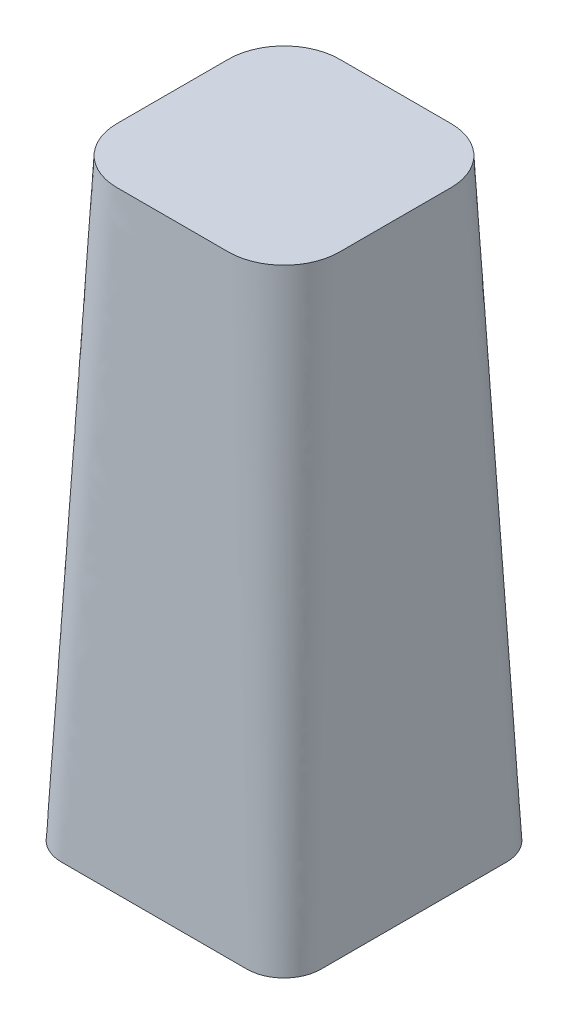
ISO-10303-21;
HEADER;
FILE_DESCRIPTION(('STEP AP214'),'2;1');
FILE_NAME('part.step','',(''),(''),'','','');
FILE_SCHEMA(('AUTOMOTIVE_DESIGN { 1 0 10303 214 1 1 1 1 }'));
ENDSEC;
DATA;
#1=APPLICATION_CONTEXT('core data for automotive mechanical design processes');
#2=APPLICATION_PROTOCOL_DEFINITION('international standard','automotive_design',2000,#1);
#3=PRODUCT_CONTEXT('',#1,'mechanical');
#4=PRODUCT('Part','Part','',(#3));
#5=PRODUCT_RELATED_PRODUCT_CATEGORY('part','',(#4));
#6=PRODUCT_DEFINITION_FORMATION('','',#4);
#7=PRODUCT_DEFINITION_CONTEXT('part definition',#1,'design');
#8=PRODUCT_DEFINITION('design','',#6,#7);
#9=PRODUCT_DEFINITION_SHAPE('','',#8);
#10=(LENGTH_UNIT() NAMED_UNIT(*) SI_UNIT(.MILLI.,.METRE.));
#11=(NAMED_UNIT(*) PLANE_ANGLE_UNIT() SI_UNIT($,.RADIAN.));
#12=(NAMED_UNIT(*) SI_UNIT($,.STERADIAN.) SOLID_ANGLE_UNIT());
#13=UNCERTAINTY_MEASURE_WITH_UNIT(LENGTH_MEASURE(1.E-05),#10,'distance_accuracy_value','');
#14=(GEOMETRIC_REPRESENTATION_CONTEXT(3) GLOBAL_UNCERTAINTY_ASSIGNED_CONTEXT((#13)) GLOBAL_UNIT_ASSIGNED_CONTEXT((#10,
#11,#12)) REPRESENTATION_CONTEXT('',''));
#15=CARTESIAN_POINT('',(0.,0.,0.));
#16=DIRECTION('',(0.,0.,1.));
#17=DIRECTION('',(1.,0.,0.));
#18=AXIS2_PLACEMENT_3D('',#15,#16,#17);
#19=CARTESIAN_POINT('',(-3.,32.,-3.));
#20=DIRECTION('',(0.,1.,0.));
#21=DIRECTION('',(0.,0.,1.));
#22=AXIS2_PLACEMENT_3D('',#19,#20,#21);
#23=PLANE('',#22);
#24=CARTESIAN_POINT('',(-3.,32.,-3.));
#25=DIRECTION('',(0.,1.,0.));
#26=DIRECTION('',(0.,0.,1.));
#27=AXIS2_PLACEMENT_3D('',#24,#25,#26);
#28=CIRCLE('',#27,3.);
#29=CARTESIAN_POINT('',(-2.99999999999998,32.,-6.));
#30=VERTEX_POINT('',#29);
#31=CARTESIAN_POINT('',(-6.,32.,-2.99999999995858));
#32=VERTEX_POINT('',#31);
#33=EDGE_CURVE('E422',#30,#32,#28,.T.);
#34=ORIENTED_EDGE('',*,*,#33,.T.);
#35=DIRECTION('',(0.,0.,1.));
#36=VECTOR('',#35,1.);
#37=CARTESIAN_POINT('',(-6.,32.,-2.99999999999998));
#38=LINE('',#37,#36);
#39=CARTESIAN_POINT('',(-6.,32.,2.99999999992025));
#40=VERTEX_POINT('',#39);
#41=EDGE_CURVE('E537',#32,#40,#38,.T.);
#42=ORIENTED_EDGE('',*,*,#41,.T.);
#43=CARTESIAN_POINT('',(-3.,32.,3.));
#44=DIRECTION('',(0.,1.,0.));
#45=DIRECTION('',(0.,0.,1.));
#46=AXIS2_PLACEMENT_3D('',#43,#44,#45);
#47=CIRCLE('',#46,3.);
#48=CARTESIAN_POINT('',(-2.9999999999586,32.,6.));
#49=VERTEX_POINT('',#48);
#50=EDGE_CURVE('E529',#40,#49,#47,.T.);
#51=ORIENTED_EDGE('',*,*,#50,.T.);
#52=DIRECTION('',(1.,0.,0.));
#53=VECTOR('',#52,1.);
#54=CARTESIAN_POINT('',(-2.99999999999998,32.,6.));
#55=LINE('',#54,#53);
#56=CARTESIAN_POINT('',(3.00000000000016,32.,6.));
#57=VERTEX_POINT('',#56);
#58=EDGE_CURVE('E523',#49,#57,#55,.T.);
#59=ORIENTED_EDGE('',*,*,#58,.T.);
#60=CARTESIAN_POINT('',(3.,32.,3.));
#61=DIRECTION('',(0.,1.,0.));
#62=DIRECTION('',(0.,0.,1.));
#63=AXIS2_PLACEMENT_3D('',#60,#61,#62);
#64=CIRCLE('',#63,3.);
#65=CARTESIAN_POINT('',(6.,32.,2.99999999995858));
#66=VERTEX_POINT('',#65);
#67=EDGE_CURVE('E515',#57,#66,#64,.T.);
#68=ORIENTED_EDGE('',*,*,#67,.T.);
#69=DIRECTION('',(0.,0.,1.));
#70=VECTOR('',#69,1.);
#71=CARTESIAN_POINT('',(6.,32.,-2.99999999999998));
#72=LINE('',#71,#70);
#73=CARTESIAN_POINT('',(6.,32.,-3.00000000000017));
#74=VERTEX_POINT('',#73);
#75=EDGE_CURVE('E507',#74,#66,#72,.T.);
#76=ORIENTED_EDGE('',*,*,#75,.F.);
#77=CARTESIAN_POINT('',(3.,32.,-3.));
#78=DIRECTION('',(0.,1.,0.));
#79=DIRECTION('',(0.,0.,1.));
#80=AXIS2_PLACEMENT_3D('',#77,#78,#79);
#81=CIRCLE('',#80,3.);
#82=CARTESIAN_POINT('',(2.99999999999998,32.,-6.));
#83=VERTEX_POINT('',#82);
#84=EDGE_CURVE('E243',#74,#83,#81,.T.);
#85=ORIENTED_EDGE('',*,*,#84,.T.);
#86=DIRECTION('',(1.,0.,0.));
#87=VECTOR('',#86,1.);
#88=CARTESIAN_POINT('',(-2.99999999999998,32.,-6.));
#89=LINE('',#88,#87);
#90=EDGE_CURVE('E12',#30,#83,#89,.T.);
#91=ORIENTED_EDGE('',*,*,#90,.F.);
#92=EDGE_LOOP('',(#34,#42,#51,#59,#68,#76,#85,#91));
#93=FACE_BOUND('',#92,.T.);
#94=ADVANCED_FACE('F231',(#93),#23,.T.);
#95=CARTESIAN_POINT('',(-5.,0.,-5.));
#96=DIRECTION('',(0.,1.,0.));
#97=DIRECTION('',(0.,0.,1.));
#98=AXIS2_PLACEMENT_3D('',#95,#96,#97);
#99=PLANE('',#98);
#100=CARTESIAN_POINT('',(-5.,0.,-5.));
#101=DIRECTION('',(0.,1.,0.));
#102=DIRECTION('',(0.,0.,1.));
#103=AXIS2_PLACEMENT_3D('',#100,#101,#102);
#104=CIRCLE('',#103,2.);
#105=CARTESIAN_POINT('',(-4.99999999999999,0.,-7.));
#106=VERTEX_POINT('',#105);
#107=CARTESIAN_POINT('',(-7.,0.,-4.99999999999999));
#108=VERTEX_POINT('',#107);
#109=EDGE_CURVE('E303',#106,#108,#104,.T.);
#110=ORIENTED_EDGE('',*,*,#109,.F.);
#111=DIRECTION('',(1.,0.,0.));
#112=VECTOR('',#111,1.);
#113=CARTESIAN_POINT('',(-4.99999999999999,0.,-7.));
#114=LINE('',#113,#112);
#115=CARTESIAN_POINT('',(4.99999999999999,0.,-7.));
#116=VERTEX_POINT('',#115);
#117=EDGE_CURVE('E312',#106,#116,#114,.T.);
#118=ORIENTED_EDGE('',*,*,#117,.T.);
#119=CARTESIAN_POINT('',(5.,0.,-5.));
#120=DIRECTION('',(0.,1.,0.));
#121=DIRECTION('',(0.,0.,1.));
#122=AXIS2_PLACEMENT_3D('',#119,#120,#121);
#123=CIRCLE('',#122,2.);
#124=CARTESIAN_POINT('',(7.,0.,-4.99999999999999));
#125=VERTEX_POINT('',#124);
#126=EDGE_CURVE('E427',#125,#116,#123,.T.);
#127=ORIENTED_EDGE('',*,*,#126,.F.);
#128=DIRECTION('',(0.,0.,1.));
#129=VECTOR('',#128,1.);
#130=CARTESIAN_POINT('',(7.,0.,-4.99999999999999));
#131=LINE('',#130,#129);
#132=CARTESIAN_POINT('',(7.,0.,4.99999999999999));
#133=VERTEX_POINT('',#132);
#134=EDGE_CURVE('E441',#125,#133,#131,.T.);
#135=ORIENTED_EDGE('',*,*,#134,.T.);
#136=CARTESIAN_POINT('',(5.,0.,5.));
#137=DIRECTION('',(0.,1.,0.));
#138=DIRECTION('',(0.,0.,1.));
#139=AXIS2_PLACEMENT_3D('',#136,#137,#138);
#140=CIRCLE('',#139,2.);
#141=CARTESIAN_POINT('',(4.99999999999999,0.,7.));
#142=VERTEX_POINT('',#141);
#143=EDGE_CURVE('E446',#142,#133,#140,.T.);
#144=ORIENTED_EDGE('',*,*,#143,.F.);
#145=DIRECTION('',(1.,0.,0.));
#146=VECTOR('',#145,1.);
#147=CARTESIAN_POINT('',(-4.99999999999999,0.,7.));
#148=LINE('',#147,#146);
#149=CARTESIAN_POINT('',(-5.,0.,7.));
#150=VERTEX_POINT('',#149);
#151=EDGE_CURVE('E461',#150,#142,#148,.T.);
#152=ORIENTED_EDGE('',*,*,#151,.F.);
#153=CARTESIAN_POINT('',(-5.,0.,5.));
#154=DIRECTION('',(0.,1.,0.));
#155=DIRECTION('',(0.,0.,1.));
#156=AXIS2_PLACEMENT_3D('',#153,#154,#155);
#157=CIRCLE('',#156,2.);
#158=CARTESIAN_POINT('',(-7.,0.,4.99999999999999));
#159=VERTEX_POINT('',#158);
#160=EDGE_CURVE('E305',#159,#150,#157,.T.);
#161=ORIENTED_EDGE('',*,*,#160,.F.);
#162=DIRECTION('',(0.,0.,1.));
#163=VECTOR('',#162,1.);
#164=CARTESIAN_POINT('',(-7.,0.,-4.99999999999999));
#165=LINE('',#164,#163);
#166=EDGE_CURVE('E300',#108,#159,#165,.T.);
#167=ORIENTED_EDGE('',*,*,#166,.F.);
#168=EDGE_LOOP('',(#110,#118,#127,#135,#144,#152,#161,#167));
#169=FACE_BOUND('',#168,.T.);
#170=ADVANCED_FACE('F297',(#169),#99,.F.);
#171=CARTESIAN_POINT('',(-7.,0.,4.99999999903776));
#172=CARTESIAN_POINT('',(-6.,32.,2.99999999921562));
#173=CARTESIAN_POINT('',(-7.,0.,5.18588729850112));
#174=CARTESIAN_POINT('',(-6.,32.,3.15152631043641));
#175=CARTESIAN_POINT('',(-6.95379278186887,0.,5.48488476142477));
#176=CARTESIAN_POINT('',(-5.97729903744131,32.,3.47485511021147));
#177=CARTESIAN_POINT('',(-6.82261176247845,0.,5.85154381484414));
#178=CARTESIAN_POINT('',(-5.84308821405571,32.,4.0175695756068));
#179=CARTESIAN_POINT('',(-6.64221849903538,0.,6.15834839398));
#180=CARTESIAN_POINT('',(-5.57097269484039,32.,4.59401173978656));
#181=CARTESIAN_POINT('',(-6.42125633129928,0.,6.42125633129927));
#182=CARTESIAN_POINT('',(-5.14086942070892,31.9999999999999,5.14086942070891));
#183=CARTESIAN_POINT('',(-6.15834839398001,0.,6.64221849903538));
#184=CARTESIAN_POINT('',(-4.59401173978658,32.,5.57097269484036));
#185=CARTESIAN_POINT('',(-5.85154381484415,0.,6.82261176247843));
#186=CARTESIAN_POINT('',(-4.01756957560682,32.,5.84308821405572));
#187=CARTESIAN_POINT('',(-5.48488476142479,0.,6.95379278186887));
#188=CARTESIAN_POINT('',(-3.4748551102115,32.,5.97729903744129));
#189=CARTESIAN_POINT('',(-5.18588729850113,0.,7.));
#190=CARTESIAN_POINT('',(-3.15152631043643,32.,6.));
#191=CARTESIAN_POINT('',(-4.27664187828878,0.,7.));
#192=CARTESIAN_POINT('',(-2.41035354114599,32.,6.));
#193=CARTESIAN_POINT('',(-2.70232647568476,0.,7.));
#194=CARTESIAN_POINT('',(-1.39560082146807,32.,6.));
#195=CARTESIAN_POINT('',(0.,0.,7.));
#196=CARTESIAN_POINT('',(0.,32.,6.));
#197=CARTESIAN_POINT('',(2.70232647568475,0.,7.));
#198=CARTESIAN_POINT('',(1.39560082146805,32.,6.));
#199=CARTESIAN_POINT('',(4.27664187828876,0.,7.));
#200=CARTESIAN_POINT('',(2.41035354114597,32.,6.));
#201=CARTESIAN_POINT('',(5.18588729850112,0.,7.));
#202=CARTESIAN_POINT('',(3.15152631043641,32.,6.));
#203=CARTESIAN_POINT('',(5.48488476142478,0.,6.95379278186887));
#204=CARTESIAN_POINT('',(3.47485511021149,32.0000000000001,5.9772990374413));
#205=CARTESIAN_POINT('',(5.85154381484415,0.,6.82261176247844));
#206=CARTESIAN_POINT('',(4.0175695756068,31.9999999999999,5.84308821405572));
#207=CARTESIAN_POINT('',(6.15834839398,0.,6.64221849903539));
#208=CARTESIAN_POINT('',(4.59401173978659,32.0000000000001,5.57097269484037));
#209=CARTESIAN_POINT('',(6.42125633129927,0.,6.42125633129926));
#210=CARTESIAN_POINT('',(5.14086942070891,32.,5.14086942070892));
#211=CARTESIAN_POINT('',(6.64221849903538,0.,6.15834839398001));
#212=CARTESIAN_POINT('',(5.57097269484039,32.,4.59401173978656));
#213=CARTESIAN_POINT('',(6.82261176247844,0.,5.85154381484415));
#214=CARTESIAN_POINT('',(5.84308821405571,32.,4.01756957560682));
#215=CARTESIAN_POINT('',(6.95379278186887,0.,5.48488476142478));
#216=CARTESIAN_POINT('',(5.97729903744131,32.,3.47485511021147));
#217=CARTESIAN_POINT('',(7.,0.,5.18588729850112));
#218=CARTESIAN_POINT('',(6.,32.,3.15152631043641));
#219=CARTESIAN_POINT('',(7.,0.,4.27664187828877));
#220=CARTESIAN_POINT('',(6.,32.,2.41035354114597));
#221=CARTESIAN_POINT('',(7.,0.,2.70232647568475));
#222=CARTESIAN_POINT('',(6.,32.,1.39560082146805));
#223=CARTESIAN_POINT('',(6.99999999999999,0.,0.));
#224=CARTESIAN_POINT('',(5.99999999999999,32.,0.));
#225=CARTESIAN_POINT('',(7.,0.,-2.70232647568475));
#226=CARTESIAN_POINT('',(6.,32.,-1.39560082146806));
#227=CARTESIAN_POINT('',(7.,0.,-4.27664187828877));
#228=CARTESIAN_POINT('',(6.,32.,-2.41035354114597));
#229=CARTESIAN_POINT('',(7.,0.,-5.18588729850112));
#230=CARTESIAN_POINT('',(6.,32.,-3.15152631043641));
#231=CARTESIAN_POINT('',(6.95379278186889,0.,-5.48488476142478));
#232=CARTESIAN_POINT('',(5.9772990374413,32.,-3.47485511021149));
#233=CARTESIAN_POINT('',(6.82261176247842,0.,-5.85154381484416));
#234=CARTESIAN_POINT('',(5.84308821405571,32.0000000000001,-4.0175695756068));
#235=CARTESIAN_POINT('',(6.64221849903539,0.,-6.15834839398));
#236=CARTESIAN_POINT('',(5.57097269484037,31.9999999999999,-4.59401173978659));
#237=CARTESIAN_POINT('',(6.42125633129926,0.,-6.42125633129928));
#238=CARTESIAN_POINT('',(5.14086942070892,32.,-5.1408694207089));
#239=CARTESIAN_POINT('',(6.15834839398,0.,-6.64221849903538));
#240=CARTESIAN_POINT('',(4.59401173978657,32.,-5.57097269484039));
#241=CARTESIAN_POINT('',(5.85154381484415,0.,-6.82261176247844));
#242=CARTESIAN_POINT('',(4.01756957560681,32.,-5.84308821405571));
#243=CARTESIAN_POINT('',(5.48488476142477,0.,-6.95379278186886));
#244=CARTESIAN_POINT('',(3.47485511021147,32.,-5.97729903744131));
#245=CARTESIAN_POINT('',(5.18588729850112,0.,-7.));
#246=CARTESIAN_POINT('',(3.15152631043641,32.,-6.));
#247=CARTESIAN_POINT('',(4.27664187828877,0.,-7.));
#248=CARTESIAN_POINT('',(2.41035354114597,32.,-6.));
#249=CARTESIAN_POINT('',(2.70232647568475,0.,-7.));
#250=CARTESIAN_POINT('',(1.39560082146805,32.,-6.));
#251=CARTESIAN_POINT('',(0.,0.,-6.99999999999999));
#252=CARTESIAN_POINT('',(0.,32.,-6.));
#253=CARTESIAN_POINT('',(-2.70232647568475,0.,-7.));
#254=CARTESIAN_POINT('',(-1.39560082146806,32.,-6.));
#255=CARTESIAN_POINT('',(-4.27664187828877,0.,-7.));
#256=CARTESIAN_POINT('',(-2.41035354114597,32.,-6.));
#257=CARTESIAN_POINT('',(-5.18588729850112,0.,-7.));
#258=CARTESIAN_POINT('',(-3.15152631043641,32.,-6.));
#259=CARTESIAN_POINT('',(-5.48488476142477,0.,-6.95379278186888));
#260=CARTESIAN_POINT('',(-3.47485511021149,32.,-5.97729903744131));
#261=CARTESIAN_POINT('',(-5.85154381484417,0.,-6.82261176247842));
#262=CARTESIAN_POINT('',(-4.01756957560679,32.,-5.84308821405571));
#263=CARTESIAN_POINT('',(-6.15834839397999,0.,-6.64221849903539));
#264=CARTESIAN_POINT('',(-4.5940117397866,32.,-5.57097269484038));
#265=CARTESIAN_POINT('',(-6.42125633129929,0.,-6.42125633129927));
#266=CARTESIAN_POINT('',(-5.14086942070889,32.,-5.14086942070891));
#267=CARTESIAN_POINT('',(-6.64221849903538,0.,-6.15834839397999));
#268=CARTESIAN_POINT('',(-5.57097269484039,32.0000000000001,-4.59401173978657));
#269=CARTESIAN_POINT('',(-6.82261176247845,0.,-5.85154381484415));
#270=CARTESIAN_POINT('',(-5.8430882140557,31.9999999999999,-4.0175695756068));
#271=CARTESIAN_POINT('',(-6.95379278186886,0.,-5.48488476142477));
#272=CARTESIAN_POINT('',(-5.97729903744131,32.,-3.47485511021148));
#273=CARTESIAN_POINT('',(-7.,0.,-5.18588729850112));
#274=CARTESIAN_POINT('',(-6.,32.,-3.15152631043641));
#275=CARTESIAN_POINT('',(-7.,0.,-4.27664187828877));
#276=CARTESIAN_POINT('',(-6.,32.,-2.41035354114597));
#277=CARTESIAN_POINT('',(-7.,0.,-2.70232647568475));
#278=CARTESIAN_POINT('',(-6.,32.,-1.39560082146805));
#279=CARTESIAN_POINT('',(-7.,0.,0.));
#280=CARTESIAN_POINT('',(-6.,32.,0.));
#281=CARTESIAN_POINT('',(-6.99999999999999,0.,2.70232647568475));
#282=CARTESIAN_POINT('',(-6.,32.,1.39560082146805));
#283=CARTESIAN_POINT('',(-7.,0.,4.27664187828876));
#284=CARTESIAN_POINT('',(-6.,32.,2.41035354114597));
#285=CARTESIAN_POINT('',(-7.,0.,4.99999999903776));
#286=CARTESIAN_POINT('',(-6.,32.,2.99999999921562));
#287=B_SPLINE_SURFACE_WITH_KNOTS('',3,1,((#171,#172),(#173,#174),(#175,#176),(#177,#178),(#179,
#180),(#181,#182),(#183,#184),(#185,#186),(#187,#188),(#189,#190),(#191,#192),(#193,#194),(#195,
#196),(#197,#198),(#199,#200),(#201,#202),(#203,#204),(#205,#206),(#207,#208),(#209,#210),(#211,
#212),(#213,#214),(#215,#216),(#217,#218),(#219,#220),(#221,#222),(#223,#224),(#225,#226),(#227,
#228),(#229,#230),(#231,#232),(#233,#234),(#235,#236),(#237,#238),(#239,#240),(#241,#242),(#243,
#244),(#245,#246),(#247,#248),(#249,#250),(#251,#252),(#253,#254),(#255,#256),(#257,#258),(#259,
#260),(#261,#262),(#263,#264),(#265,#266),(#267,#268),(#269,#270),(#271,#272),(#273,#274),(#275,
#276),(#277,#278),(#279,#280),(#281,#282),(#283,#284),(#285,#286)),.UNSPECIFIED.,.T.,.F.,.F.,(4,
1,1,1,1,1,1,1,2,1,1,1,2,1,1,1,1,1,1,1,2,1,1,1,2,1,1,1,1,1,1,1,2,1,1,1,2,1,1,1,1,1,1,1,2,1,1,1,
4),(2,2),(0.,0.010608719845299,0.0212174396905979,0.0318261595358969,0.0424348793811959,
0.0530435992264948,0.0636523190717938,0.0742610389170928,0.0848697587623918,0.126152319071794,
0.167434879381196,0.208717439690598,0.25,0.260608719845299,0.271217439690598,0.281826159535897,
0.292434879381196,0.303043599226495,0.313652319071794,0.324261038917093,0.334869758762392,
0.376152319071794,0.417434879381196,0.458717439690598,0.5,0.510608719845299,0.521217439690598,
0.531826159535897,0.542434879381196,0.553043599226495,0.563652319071794,0.574261038917093,
0.584869758762392,0.626152319071794,0.667434879381196,0.708717439690598,0.75,0.760608719845299,
0.771217439690598,0.781826159535897,0.792434879381196,0.803043599226495,0.813652319071794,
0.824261038917093,0.834869758762392,0.876152319071794,0.917434879381196,0.958717439690598,1.),
(0.,1.),.UNSPECIFIED.);
#288=CARTESIAN_POINT('',(0.,0.,-7.));
#289=CARTESIAN_POINT('',(0.,32.,-6.));
#290=CARTESIAN_POINT('',(-0.90077549189492,0.,-7.));
#291=CARTESIAN_POINT('',(-0.465200273822688,32.,-6.));
#292=CARTESIAN_POINT('',(-2.70232647568475,0.,-7.));
#293=CARTESIAN_POINT('',(-1.39560082146806,32.,-6.));
#294=CARTESIAN_POINT('',(-4.27664187828877,0.,-7.));
#295=CARTESIAN_POINT('',(-2.41035354114597,32.,-6.));
#296=CARTESIAN_POINT('',(-5.18588729850112,0.,-7.));
#297=CARTESIAN_POINT('',(-3.15152631043641,32.,-6.));
#298=CARTESIAN_POINT('',(-5.48488476142477,0.,-6.95379278186888));
#299=CARTESIAN_POINT('',(-3.47485511021149,32.,-5.97729903744131));
#300=CARTESIAN_POINT('',(-5.85154381484417,0.,-6.82261176247842));
#301=CARTESIAN_POINT('',(-4.01756957560679,32.,-5.84308821405571));
#302=CARTESIAN_POINT('',(-6.15834839397999,0.,-6.64221849903539));
#303=CARTESIAN_POINT('',(-4.5940117397866,32.,-5.57097269484038));
#304=CARTESIAN_POINT('',(-6.42125633129929,0.,-6.42125633129927));
#305=CARTESIAN_POINT('',(-5.14086942070889,32.,-5.14086942070891));
#306=CARTESIAN_POINT('',(-6.64221849903538,0.,-6.15834839397999));
#307=CARTESIAN_POINT('',(-5.57097269484039,32.0000000000001,-4.59401173978657));
#308=CARTESIAN_POINT('',(-6.82261176247845,0.,-5.85154381484415));
#309=CARTESIAN_POINT('',(-5.8430882140557,31.9999999999999,-4.0175695756068));
#310=CARTESIAN_POINT('',(-6.95379278186886,0.,-5.48488476142477));
#311=CARTESIAN_POINT('',(-5.97729903744131,32.,-3.47485511021148));
#312=CARTESIAN_POINT('',(-7.,0.,-5.18588729850112));
#313=CARTESIAN_POINT('',(-6.,32.,-3.15152631043641));
#314=CARTESIAN_POINT('',(-7.,0.,-4.27664187828877));
#315=CARTESIAN_POINT('',(-6.,32.,-2.41035354114597));
#316=CARTESIAN_POINT('',(-7.,0.,-2.70232647568475));
#317=CARTESIAN_POINT('',(-6.,32.,-1.39560082146805));
#318=CARTESIAN_POINT('',(-7.,0.,0.));
#319=CARTESIAN_POINT('',(-6.,32.,0.));
#320=CARTESIAN_POINT('',(-6.99999999999999,0.,2.70232647568475));
#321=CARTESIAN_POINT('',(-6.,32.,1.39560082146805));
#322=CARTESIAN_POINT('',(-7.,0.,4.27664187828876));
#323=CARTESIAN_POINT('',(-6.,32.,2.41035354114597));
#324=CARTESIAN_POINT('',(-7.,0.,5.18588729850112));
#325=CARTESIAN_POINT('',(-6.,32.,3.15152631043641));
#326=CARTESIAN_POINT('',(-6.95379278186887,0.,5.48488476142477));
#327=CARTESIAN_POINT('',(-5.97729903744131,32.,3.47485511021147));
#328=CARTESIAN_POINT('',(-6.82261176247845,0.,5.85154381484414));
#329=CARTESIAN_POINT('',(-5.84308821405571,32.,4.0175695756068));
#330=CARTESIAN_POINT('',(-6.64221849903538,0.,6.15834839398));
#331=CARTESIAN_POINT('',(-5.57097269484039,32.,4.59401173978656));
#332=CARTESIAN_POINT('',(-6.42125633129928,0.,6.42125633129927));
#333=CARTESIAN_POINT('',(-5.14086942070892,31.9999999999999,5.14086942070891));
#334=CARTESIAN_POINT('',(-6.15834839398001,0.,6.64221849903538));
#335=CARTESIAN_POINT('',(-4.59401173978658,32.,5.57097269484036));
#336=CARTESIAN_POINT('',(-5.85154381484415,0.,6.82261176247843));
#337=CARTESIAN_POINT('',(-4.01756957560682,32.,5.84308821405572));
#338=CARTESIAN_POINT('',(-5.48488476142479,0.,6.95379278186887));
#339=CARTESIAN_POINT('',(-3.4748551102115,32.,5.97729903744129));
#340=CARTESIAN_POINT('',(-5.18588729850113,0.,7.));
#341=CARTESIAN_POINT('',(-3.15152631043643,32.,6.));
#342=CARTESIAN_POINT('',(-4.27664187828878,0.,7.));
#343=CARTESIAN_POINT('',(-2.41035354114599,32.,6.));
#344=CARTESIAN_POINT('',(-2.70232647568476,0.,7.));
#345=CARTESIAN_POINT('',(-1.39560082146807,32.,6.));
#346=CARTESIAN_POINT('',(0.,0.,7.));
#347=CARTESIAN_POINT('',(0.,32.,6.));
#348=CARTESIAN_POINT('',(2.70232647568475,0.,7.));
#349=CARTESIAN_POINT('',(1.39560082146805,32.,6.));
#350=CARTESIAN_POINT('',(4.27664187828876,0.,7.));
#351=CARTESIAN_POINT('',(2.41035354114597,32.,6.));
#352=CARTESIAN_POINT('',(5.18588729850112,0.,7.));
#353=CARTESIAN_POINT('',(3.15152631043641,32.,6.));
#354=CARTESIAN_POINT('',(5.48488476142478,0.,6.95379278186887));
#355=CARTESIAN_POINT('',(3.47485511021149,32.0000000000001,5.9772990374413));
#356=CARTESIAN_POINT('',(5.85154381484415,0.,6.82261176247844));
#357=CARTESIAN_POINT('',(4.0175695756068,31.9999999999999,5.84308821405572));
#358=CARTESIAN_POINT('',(6.15834839398,0.,6.64221849903539));
#359=CARTESIAN_POINT('',(4.59401173978659,32.0000000000001,5.57097269484037));
#360=CARTESIAN_POINT('',(6.42125633129927,0.,6.42125633129926));
#361=CARTESIAN_POINT('',(5.14086942070891,32.,5.14086942070892));
#362=CARTESIAN_POINT('',(6.64221849903538,0.,6.15834839398001));
#363=CARTESIAN_POINT('',(5.57097269484039,32.,4.59401173978656));
#364=CARTESIAN_POINT('',(6.82261176247844,0.,5.85154381484415));
#365=CARTESIAN_POINT('',(5.84308821405571,32.,4.01756957560682));
#366=CARTESIAN_POINT('',(6.95379278186887,0.,5.48488476142478));
#367=CARTESIAN_POINT('',(5.97729903744131,32.,3.47485511021147));
#368=CARTESIAN_POINT('',(7.,0.,5.18588729850112));
#369=CARTESIAN_POINT('',(6.,32.,3.15152631043641));
#370=CARTESIAN_POINT('',(7.,0.,4.27664187828877));
#371=CARTESIAN_POINT('',(6.,32.,2.41035354114597));
#372=CARTESIAN_POINT('',(7.,0.,2.70232647568475));
#373=CARTESIAN_POINT('',(6.,32.,1.39560082146805));
#374=CARTESIAN_POINT('',(6.99999999999999,0.,0.));
#375=CARTESIAN_POINT('',(5.99999999999999,32.,0.));
#376=CARTESIAN_POINT('',(7.,0.,-2.70232647568475));
#377=CARTESIAN_POINT('',(6.,32.,-1.39560082146806));
#378=CARTESIAN_POINT('',(7.,0.,-4.27664187828877));
#379=CARTESIAN_POINT('',(6.,32.,-2.41035354114597));
#380=CARTESIAN_POINT('',(7.,0.,-5.18588729850112));
#381=CARTESIAN_POINT('',(6.,32.,-3.15152631043641));
#382=CARTESIAN_POINT('',(6.95379278186889,0.,-5.48488476142478));
#383=CARTESIAN_POINT('',(5.9772990374413,32.,-3.47485511021149));
#384=CARTESIAN_POINT('',(6.82261176247842,0.,-5.85154381484416));
#385=CARTESIAN_POINT('',(5.84308821405571,32.0000000000001,-4.0175695756068));
#386=CARTESIAN_POINT('',(6.64221849903539,0.,-6.15834839398));
#387=CARTESIAN_POINT('',(5.57097269484037,31.9999999999999,-4.59401173978659));
#388=CARTESIAN_POINT('',(6.42125633129926,0.,-6.42125633129928));
#389=CARTESIAN_POINT('',(5.14086942070892,32.,-5.1408694207089));
#390=CARTESIAN_POINT('',(6.15834839398,0.,-6.64221849903538));
#391=CARTESIAN_POINT('',(4.59401173978657,32.,-5.57097269484039));
#392=CARTESIAN_POINT('',(5.85154381484415,0.,-6.82261176247844));
#393=CARTESIAN_POINT('',(4.01756957560681,32.,-5.84308821405571));
#394=CARTESIAN_POINT('',(5.48488476142477,0.,-6.95379278186886));
#395=CARTESIAN_POINT('',(3.47485511021147,32.,-5.97729903744131));
#396=CARTESIAN_POINT('',(5.18588729850112,0.,-7.));
#397=CARTESIAN_POINT('',(3.15152631043641,32.,-6.));
#398=CARTESIAN_POINT('',(4.27664187828877,0.,-7.));
#399=CARTESIAN_POINT('',(2.41035354114597,32.,-6.));
#400=CARTESIAN_POINT('',(2.70232647568475,0.,-7.));
#401=CARTESIAN_POINT('',(1.39560082146805,32.,-6.));
#402=CARTESIAN_POINT('',(0.900775491894916,0.,-7.));
#403=CARTESIAN_POINT('',(0.465200273822682,32.,-6.));
#404=CARTESIAN_POINT('',(0.,0.,-7.));
#405=CARTESIAN_POINT('',(0.,32.,-6.));
#406=B_SPLINE_SURFACE_WITH_KNOTS('',3,1,((#288,#289),(#290,#291),(#292,#293),(#294,#295),(#296,
#297),(#298,#299),(#300,#301),(#302,#303),(#304,#305),(#306,#307),(#308,#309),(#310,#311),(#312,
#313),(#314,#315),(#316,#317),(#318,#319),(#320,#321),(#322,#323),(#324,#325),(#326,#327),(#328,
#329),(#330,#331),(#332,#333),(#334,#335),(#336,#337),(#338,#339),(#340,#341),(#342,#343),(#344,
#345),(#346,#347),(#348,#349),(#350,#351),(#352,#353),(#354,#355),(#356,#357),(#358,#359),(#360,
#361),(#362,#363),(#364,#365),(#366,#367),(#368,#369),(#370,#371),(#372,#373),(#374,#375),(#376,
#377),(#378,#379),(#380,#381),(#382,#383),(#384,#385),(#386,#387),(#388,#389),(#390,#391),(#392,
#393),(#394,#395),(#396,#397),(#398,#399),(#400,#401),(#402,#403),(#404,#405)),.UNSPECIFIED.,
.T.,.F.,.F.,(4,1,2,1,1,1,1,1,1,1,2,1,1,1,2,1,1,1,1,1,1,1,2,1,1,1,2,1,1,1,1,1,1,1,2,1,1,1,2,1,1,
1,1,1,1,1,2,1,4),(2,2),(0.667434879381196,0.708717439690598,0.75,0.760608719845299,
0.771217439690598,0.781826159535897,0.792434879381196,0.803043599226495,0.813652319071794,
0.824261038917093,0.834869758762392,0.876152319071794,0.917434879381196,0.958717439690598,1.,
1.0106087198453,1.0212174396906,1.0318261595359,1.0424348793812,1.05304359922649,
1.06365231907179,1.07426103891709,1.08486975876239,1.12615231907179,1.1674348793812,
1.2087174396906,1.25,1.2606087198453,1.2712174396906,1.2818261595359,1.2924348793812,
1.3030435992265,1.31365231907179,1.32426103891709,1.33486975876239,1.37615231907179,
1.4174348793812,1.4587174396906,1.5,1.5106087198453,1.5212174396906,1.5318261595359,
1.5424348793812,1.5530435992265,1.56365231907179,1.57426103891709,1.58486975876239,
1.62615231907179,1.6674348793812),(0.,1.),.UNSPECIFIED.);
#407=ORIENTED_EDGE('',*,*,#109,.T.);
#408=ORIENTED_EDGE('',*,*,#166,.T.);
#409=ORIENTED_EDGE('',*,*,#160,.T.);
#410=ORIENTED_EDGE('',*,*,#151,.T.);
#411=ORIENTED_EDGE('',*,*,#143,.T.);
#412=ORIENTED_EDGE('',*,*,#134,.F.);
#413=ORIENTED_EDGE('',*,*,#126,.T.);
#414=ORIENTED_EDGE('',*,*,#117,.F.);
#415=EDGE_LOOP('',(#407,#408,#409,#410,#411,#412,#413,#414));
#416=FACE_BOUND('',#415,.T.);
#417=ORIENTED_EDGE('',*,*,#90,.T.);
#418=ORIENTED_EDGE('',*,*,#84,.F.);
#419=ORIENTED_EDGE('',*,*,#75,.T.);
#420=ORIENTED_EDGE('',*,*,#67,.F.);
#421=ORIENTED_EDGE('',*,*,#58,.F.);
#422=ORIENTED_EDGE('',*,*,#50,.F.);
#423=ORIENTED_EDGE('',*,*,#41,.F.);
#424=ORIENTED_EDGE('',*,*,#33,.F.);
#425=EDGE_LOOP('',(#417,#418,#419,#420,#421,#422,#423,#424));
#426=FACE_BOUND('',#425,.T.);
#427=ADVANCED_FACE('F315',(#416,#426),#406,.T.);
#428=CLOSED_SHELL('',(#94,#170,#427));
#429=MANIFOLD_SOLID_BREP('B2',#428);
#430=ADVANCED_BREP_SHAPE_REPRESENTATION('',(#18,#429),#14);
#431=SHAPE_DEFINITION_REPRESENTATION(#9,#430);
ENDSEC;
END-ISO-10303-21;
